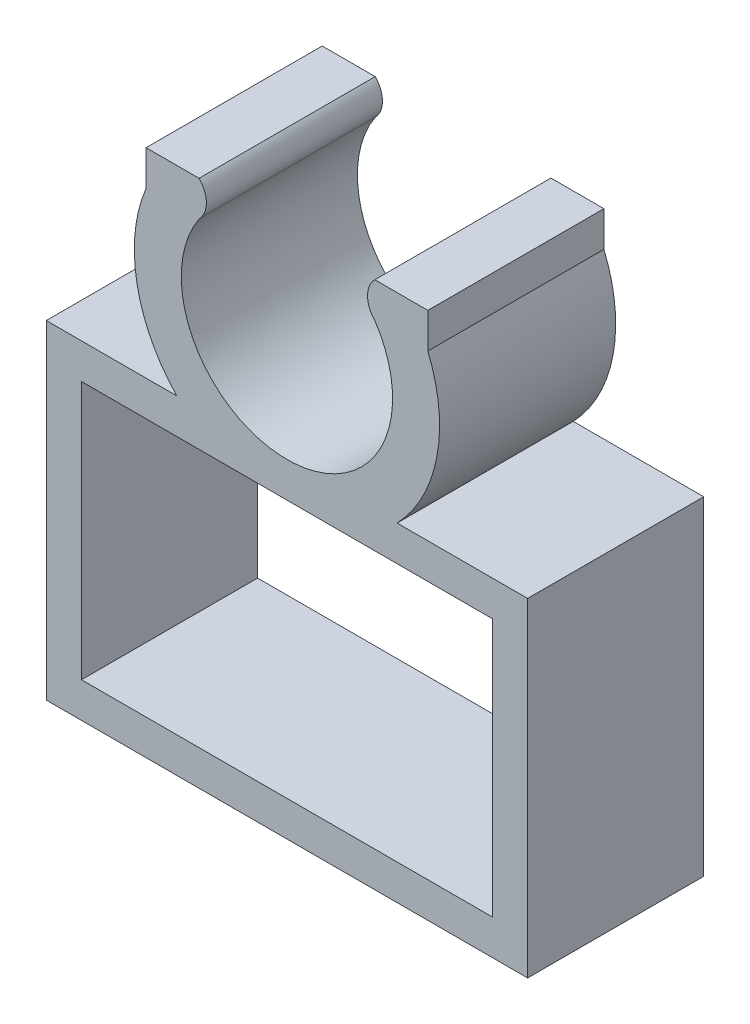
ISO-10303-21;
HEADER;
FILE_DESCRIPTION(('STEP AP214'),'2;1');
FILE_NAME('part.step','',(''),(''),'','','');
FILE_SCHEMA(('AUTOMOTIVE_DESIGN { 1 0 10303 214 1 1 1 1 }'));
ENDSEC;
DATA;
#1=APPLICATION_CONTEXT('core data for automotive mechanical design processes');
#2=APPLICATION_PROTOCOL_DEFINITION('international standard','automotive_design',2000,#1);
#3=PRODUCT_CONTEXT('',#1,'mechanical');
#4=PRODUCT('Part','Part','',(#3));
#5=PRODUCT_RELATED_PRODUCT_CATEGORY('part','',(#4));
#6=PRODUCT_DEFINITION_FORMATION('','',#4);
#7=PRODUCT_DEFINITION_CONTEXT('part definition',#1,'design');
#8=PRODUCT_DEFINITION('design','',#6,#7);
#9=PRODUCT_DEFINITION_SHAPE('','',#8);
#10=(LENGTH_UNIT() NAMED_UNIT(*) SI_UNIT(.MILLI.,.METRE.));
#11=(NAMED_UNIT(*) PLANE_ANGLE_UNIT() SI_UNIT($,.RADIAN.));
#12=(NAMED_UNIT(*) SI_UNIT($,.STERADIAN.) SOLID_ANGLE_UNIT());
#13=UNCERTAINTY_MEASURE_WITH_UNIT(LENGTH_MEASURE(1.E-05),#10,'distance_accuracy_value','');
#14=(GEOMETRIC_REPRESENTATION_CONTEXT(3) GLOBAL_UNCERTAINTY_ASSIGNED_CONTEXT((#13)) GLOBAL_UNIT_ASSIGNED_CONTEXT((#10,
#11,#12)) REPRESENTATION_CONTEXT('',''));
#15=CARTESIAN_POINT('',(0.,0.,0.));
#16=DIRECTION('',(0.,0.,1.));
#17=DIRECTION('',(1.,0.,0.));
#18=AXIS2_PLACEMENT_3D('',#15,#16,#17);
#19=CARTESIAN_POINT('',(-48.9571035799106,17.2183139224821,15.));
#20=DIRECTION('',(0.,0.,1.));
#21=DIRECTION('',(1.,0.,0.));
#22=AXIS2_PLACEMENT_3D('',#19,#20,#21);
#23=PLANE('',#22);
#24=DIRECTION('',(-1.,0.,0.));
#25=VECTOR('',#24,1.);
#26=CARTESIAN_POINT('',(-69.4571035799108,8.2183139224821,15.));
#27=LINE('',#26,#25);
#28=CARTESIAN_POINT('',(-58.3379350995576,8.2183139224821,15.));
#29=VERTEX_POINT('',#28);
#30=CARTESIAN_POINT('',(-69.4571035799108,8.2183139224821,15.));
#31=VERTEX_POINT('',#30);
#32=EDGE_CURVE('E194',#29,#31,#27,.T.);
#33=ORIENTED_EDGE('',*,*,#32,.T.);
#34=DIRECTION('',(0.,-1.,0.));
#35=VECTOR('',#34,1.);
#36=CARTESIAN_POINT('',(-69.4571035799108,8.2183139224821,15.));
#37=LINE('',#36,#35);
#38=CARTESIAN_POINT('',(-69.4571035799108,-19.7816860775179,15.));
#39=VERTEX_POINT('',#38);
#40=EDGE_CURVE('E197',#31,#39,#37,.T.);
#41=ORIENTED_EDGE('',*,*,#40,.T.);
#42=DIRECTION('',(1.,0.,0.));
#43=VECTOR('',#42,1.);
#44=CARTESIAN_POINT('',(-69.4571035799108,-19.7816860775179,15.));
#45=LINE('',#44,#43);
#46=CARTESIAN_POINT('',(-28.4571035799108,-19.7816860775179,15.));
#47=VERTEX_POINT('',#46);
#48=EDGE_CURVE('E200',#39,#47,#45,.T.);
#49=ORIENTED_EDGE('',*,*,#48,.T.);
#50=DIRECTION('',(0.,1.,0.));
#51=VECTOR('',#50,1.);
#52=CARTESIAN_POINT('',(-28.4571035799108,8.21831392248211,15.));
#53=LINE('',#52,#51);
#54=CARTESIAN_POINT('',(-28.4571035799108,8.21831392248211,15.));
#55=VERTEX_POINT('',#54);
#56=EDGE_CURVE('E202',#47,#55,#53,.T.);
#57=ORIENTED_EDGE('',*,*,#56,.T.);
#58=DIRECTION('',(-1.,0.,0.));
#59=VECTOR('',#58,1.);
#60=CARTESIAN_POINT('',(-28.4571035799108,8.21831392248211,15.));
#61=LINE('',#60,#59);
#62=CARTESIAN_POINT('',(-39.5762720602639,8.21831392248211,15.));
#63=VERTEX_POINT('',#62);
#64=EDGE_CURVE('E204',#55,#63,#61,.T.);
#65=ORIENTED_EDGE('',*,*,#64,.T.);
#66=CARTESIAN_POINT('',(-48.9571035799108,17.2183139224821,15.));
#67=DIRECTION('',(0.,0.,1.));
#68=DIRECTION('',(-1.,0.,0.));
#69=AXIS2_PLACEMENT_3D('',#66,#67,#68);
#70=CIRCLE('',#69,13.);
#71=CARTESIAN_POINT('',(-36.9571035799108,22.2183139224821,15.));
#72=VERTEX_POINT('',#71);
#73=EDGE_CURVE('E206',#63,#72,#70,.T.);
#74=ORIENTED_EDGE('',*,*,#73,.T.);
#75=DIRECTION('',(0.,1.,0.));
#76=VECTOR('',#75,1.);
#77=CARTESIAN_POINT('',(-36.9571035799108,25.2183139224821,15.));
#78=LINE('',#77,#76);
#79=CARTESIAN_POINT('',(-36.9571035799108,25.2183139224821,15.));
#80=VERTEX_POINT('',#79);
#81=EDGE_CURVE('E208',#72,#80,#78,.T.);
#82=ORIENTED_EDGE('',*,*,#81,.T.);
#83=DIRECTION('',(-1.,0.,0.));
#84=VECTOR('',#83,1.);
#85=CARTESIAN_POINT('',(-41.4737888063629,25.2183139224821,15.));
#86=LINE('',#85,#84);
#87=CARTESIAN_POINT('',(-41.4737888063629,25.2183139224821,15.));
#88=VERTEX_POINT('',#87);
#89=EDGE_CURVE('E210',#80,#88,#86,.T.);
#90=ORIENTED_EDGE('',*,*,#89,.T.);
#91=CARTESIAN_POINT('',(-39.9737888063629,23.7183139224821,15.));
#92=DIRECTION('',(0.,0.,1.));
#93=DIRECTION('',(-1.,0.,0.));
#94=AXIS2_PLACEMENT_3D('',#91,#92,#93);
#95=CIRCLE('',#94,2.12132034355964);
#96=CARTESIAN_POINT('',(-41.4737888063629,22.2183139224821,15.));
#97=VERTEX_POINT('',#96);
#98=EDGE_CURVE('E212',#88,#97,#95,.T.);
#99=ORIENTED_EDGE('',*,*,#98,.T.);
#100=CARTESIAN_POINT('',(-48.9571035799108,17.2183139224821,15.));
#101=DIRECTION('',(0.,0.,-1.));
#102=DIRECTION('',(1.,0.,0.));
#103=AXIS2_PLACEMENT_3D('',#100,#101,#102);
#104=CIRCLE('',#103,9.00000000000001);
#105=CARTESIAN_POINT('',(-56.4404183534587,22.2183139224821,15.));
#106=VERTEX_POINT('',#105);
#107=EDGE_CURVE('E214',#97,#106,#104,.T.);
#108=ORIENTED_EDGE('',*,*,#107,.T.);
#109=CARTESIAN_POINT('',(-57.9404183534587,23.7183139224821,15.));
#110=DIRECTION('',(0.,0.,1.));
#111=DIRECTION('',(1.,0.,0.));
#112=AXIS2_PLACEMENT_3D('',#109,#110,#111);
#113=CIRCLE('',#112,2.12132034355964);
#114=CARTESIAN_POINT('',(-56.4404183534587,25.2183139224821,15.));
#115=VERTEX_POINT('',#114);
#116=EDGE_CURVE('E216',#106,#115,#113,.T.);
#117=ORIENTED_EDGE('',*,*,#116,.T.);
#118=DIRECTION('',(-1.,0.,0.));
#119=VECTOR('',#118,1.);
#120=CARTESIAN_POINT('',(-56.4404183534587,25.2183139224821,15.));
#121=LINE('',#120,#119);
#122=CARTESIAN_POINT('',(-60.9571035799108,25.2183139224821,15.));
#123=VERTEX_POINT('',#122);
#124=EDGE_CURVE('E218',#115,#123,#121,.T.);
#125=ORIENTED_EDGE('',*,*,#124,.T.);
#126=DIRECTION('',(0.,-1.,0.));
#127=VECTOR('',#126,1.);
#128=CARTESIAN_POINT('',(-60.9571035799108,25.2183139224821,15.));
#129=LINE('',#128,#127);
#130=CARTESIAN_POINT('',(-60.9571035799108,22.2183139224821,15.));
#131=VERTEX_POINT('',#130);
#132=EDGE_CURVE('E220',#123,#131,#129,.T.);
#133=ORIENTED_EDGE('',*,*,#132,.T.);
#134=CARTESIAN_POINT('',(-48.9571035799106,17.2183139224821,15.));
#135=DIRECTION('',(0.,0.,1.));
#136=DIRECTION('',(1.,0.,0.));
#137=AXIS2_PLACEMENT_3D('',#134,#135,#136);
#138=CIRCLE('',#137,13.0000000000001);
#139=EDGE_CURVE('E222',#131,#29,#138,.T.);
#140=ORIENTED_EDGE('',*,*,#139,.T.);
#141=EDGE_LOOP('',(#33,#41,#49,#57,#65,#74,#82,#90,#99,#108,#117,#125,#133,#140));
#142=FACE_BOUND('',#141,.T.);
#143=DIRECTION('',(1.,0.,0.));
#144=VECTOR('',#143,1.);
#145=CARTESIAN_POINT('',(-66.4571035799108,-16.7816860775179,15.));
#146=LINE('',#145,#144);
#147=CARTESIAN_POINT('',(-66.4571035799108,-16.7816860775179,15.));
#148=VERTEX_POINT('',#147);
#149=CARTESIAN_POINT('',(-31.4571035799108,-16.7816860775179,15.));
#150=VERTEX_POINT('',#149);
#151=EDGE_CURVE('E166',#148,#150,#146,.T.);
#152=ORIENTED_EDGE('',*,*,#151,.F.);
#153=DIRECTION('',(0.,-1.,0.));
#154=VECTOR('',#153,1.);
#155=CARTESIAN_POINT('',(-66.4571035799108,5.21831392248211,15.));
#156=LINE('',#155,#154);
#157=CARTESIAN_POINT('',(-66.4571035799108,5.21831392248211,15.));
#158=VERTEX_POINT('',#157);
#159=EDGE_CURVE('E158',#158,#148,#156,.T.);
#160=ORIENTED_EDGE('',*,*,#159,.F.);
#161=DIRECTION('',(-1.,0.,0.));
#162=VECTOR('',#161,1.);
#163=CARTESIAN_POINT('',(-66.4571035799108,5.21831392248211,15.));
#164=LINE('',#163,#162);
#165=CARTESIAN_POINT('',(-31.4571035799108,5.21831392248211,15.));
#166=VERTEX_POINT('',#165);
#167=EDGE_CURVE('E180',#166,#158,#164,.T.);
#168=ORIENTED_EDGE('',*,*,#167,.F.);
#169=DIRECTION('',(0.,1.,0.));
#170=VECTOR('',#169,1.);
#171=CARTESIAN_POINT('',(-31.4571035799108,5.21831392248211,15.));
#172=LINE('',#171,#170);
#173=EDGE_CURVE('E178',#150,#166,#172,.T.);
#174=ORIENTED_EDGE('',*,*,#173,.F.);
#175=EDGE_LOOP('',(#152,#160,#168,#174));
#176=FACE_BOUND('',#175,.T.);
#177=ADVANCED_FACE('F33',(#142,#176),#23,.T.);
#178=CARTESIAN_POINT('',(-48.9571035799106,17.2183139224821,0.));
#179=DIRECTION('',(0.,0.,1.));
#180=DIRECTION('',(1.,0.,0.));
#181=AXIS2_PLACEMENT_3D('',#178,#179,#180);
#182=PLANE('',#181);
#183=DIRECTION('',(-1.,0.,0.));
#184=VECTOR('',#183,1.);
#185=CARTESIAN_POINT('',(-69.4571035799108,8.2183139224821,0.));
#186=LINE('',#185,#184);
#187=CARTESIAN_POINT('',(-58.3379350995576,8.2183139224821,0.));
#188=VERTEX_POINT('',#187);
#189=CARTESIAN_POINT('',(-69.4571035799108,8.2183139224821,0.));
#190=VERTEX_POINT('',#189);
#191=EDGE_CURVE('E174',#188,#190,#186,.T.);
#192=ORIENTED_EDGE('',*,*,#191,.F.);
#193=CARTESIAN_POINT('',(-48.9571035799106,17.2183139224821,0.));
#194=DIRECTION('',(0.,0.,1.));
#195=DIRECTION('',(1.,0.,0.));
#196=AXIS2_PLACEMENT_3D('',#193,#194,#195);
#197=CIRCLE('',#196,13.0000000000001);
#198=CARTESIAN_POINT('',(-60.9571035799108,22.2183139224821,0.));
#199=VERTEX_POINT('',#198);
#200=EDGE_CURVE('E198',#199,#188,#197,.T.);
#201=ORIENTED_EDGE('',*,*,#200,.F.);
#202=DIRECTION('',(0.,-1.,0.));
#203=VECTOR('',#202,1.);
#204=CARTESIAN_POINT('',(-60.9571035799108,25.2183139224821,0.));
#205=LINE('',#204,#203);
#206=CARTESIAN_POINT('',(-60.9571035799108,25.2183139224821,0.));
#207=VERTEX_POINT('',#206);
#208=EDGE_CURVE('E249',#207,#199,#205,.T.);
#209=ORIENTED_EDGE('',*,*,#208,.F.);
#210=DIRECTION('',(-1.,0.,0.));
#211=VECTOR('',#210,1.);
#212=CARTESIAN_POINT('',(-56.4404183534587,25.2183139224821,0.));
#213=LINE('',#212,#211);
#214=CARTESIAN_POINT('',(-56.4404183534587,25.2183139224821,0.));
#215=VERTEX_POINT('',#214);
#216=EDGE_CURVE('E247',#215,#207,#213,.T.);
#217=ORIENTED_EDGE('',*,*,#216,.F.);
#218=CARTESIAN_POINT('',(-57.9404183534587,23.7183139224821,0.));
#219=DIRECTION('',(0.,0.,1.));
#220=DIRECTION('',(1.,0.,0.));
#221=AXIS2_PLACEMENT_3D('',#218,#219,#220);
#222=CIRCLE('',#221,2.12132034355964);
#223=CARTESIAN_POINT('',(-56.4404183534587,22.2183139224821,0.));
#224=VERTEX_POINT('',#223);
#225=EDGE_CURVE('E245',#224,#215,#222,.T.);
#226=ORIENTED_EDGE('',*,*,#225,.F.);
#227=CARTESIAN_POINT('',(-48.9571035799108,17.2183139224821,0.));
#228=DIRECTION('',(0.,0.,-1.));
#229=DIRECTION('',(1.,0.,0.));
#230=AXIS2_PLACEMENT_3D('',#227,#228,#229);
#231=CIRCLE('',#230,9.00000000000001);
#232=CARTESIAN_POINT('',(-41.4737888063629,22.2183139224821,0.));
#233=VERTEX_POINT('',#232);
#234=EDGE_CURVE('E243',#233,#224,#231,.T.);
#235=ORIENTED_EDGE('',*,*,#234,.F.);
#236=CARTESIAN_POINT('',(-39.9737888063629,23.7183139224821,0.));
#237=DIRECTION('',(0.,0.,1.));
#238=DIRECTION('',(-1.,0.,0.));
#239=AXIS2_PLACEMENT_3D('',#236,#237,#238);
#240=CIRCLE('',#239,2.12132034355964);
#241=CARTESIAN_POINT('',(-41.4737888063629,25.2183139224821,0.));
#242=VERTEX_POINT('',#241);
#243=EDGE_CURVE('E241',#242,#233,#240,.T.);
#244=ORIENTED_EDGE('',*,*,#243,.F.);
#245=DIRECTION('',(-1.,0.,0.));
#246=VECTOR('',#245,1.);
#247=CARTESIAN_POINT('',(-41.4737888063629,25.2183139224821,0.));
#248=LINE('',#247,#246);
#249=CARTESIAN_POINT('',(-36.9571035799108,25.2183139224821,0.));
#250=VERTEX_POINT('',#249);
#251=EDGE_CURVE('E239',#250,#242,#248,.T.);
#252=ORIENTED_EDGE('',*,*,#251,.F.);
#253=DIRECTION('',(0.,1.,0.));
#254=VECTOR('',#253,1.);
#255=CARTESIAN_POINT('',(-36.9571035799108,25.2183139224821,0.));
#256=LINE('',#255,#254);
#257=CARTESIAN_POINT('',(-36.9571035799108,22.2183139224821,0.));
#258=VERTEX_POINT('',#257);
#259=EDGE_CURVE('E237',#258,#250,#256,.T.);
#260=ORIENTED_EDGE('',*,*,#259,.F.);
#261=CARTESIAN_POINT('',(-48.9571035799108,17.2183139224821,0.));
#262=DIRECTION('',(0.,0.,1.));
#263=DIRECTION('',(-1.,0.,0.));
#264=AXIS2_PLACEMENT_3D('',#261,#262,#263);
#265=CIRCLE('',#264,13.);
#266=CARTESIAN_POINT('',(-39.5762720602639,8.21831392248211,0.));
#267=VERTEX_POINT('',#266);
#268=EDGE_CURVE('E235',#267,#258,#265,.T.);
#269=ORIENTED_EDGE('',*,*,#268,.F.);
#270=DIRECTION('',(-1.,0.,0.));
#271=VECTOR('',#270,1.);
#272=CARTESIAN_POINT('',(-28.4571035799108,8.21831392248211,0.));
#273=LINE('',#272,#271);
#274=CARTESIAN_POINT('',(-28.4571035799108,8.21831392248211,0.));
#275=VERTEX_POINT('',#274);
#276=EDGE_CURVE('E233',#275,#267,#273,.T.);
#277=ORIENTED_EDGE('',*,*,#276,.F.);
#278=DIRECTION('',(0.,1.,0.));
#279=VECTOR('',#278,1.);
#280=CARTESIAN_POINT('',(-28.4571035799108,8.21831392248211,0.));
#281=LINE('',#280,#279);
#282=CARTESIAN_POINT('',(-28.4571035799108,-19.7816860775179,0.));
#283=VERTEX_POINT('',#282);
#284=EDGE_CURVE('E231',#283,#275,#281,.T.);
#285=ORIENTED_EDGE('',*,*,#284,.F.);
#286=DIRECTION('',(1.,0.,0.));
#287=VECTOR('',#286,1.);
#288=CARTESIAN_POINT('',(-69.4571035799108,-19.7816860775179,0.));
#289=LINE('',#288,#287);
#290=CARTESIAN_POINT('',(-69.4571035799108,-19.7816860775179,0.));
#291=VERTEX_POINT('',#290);
#292=EDGE_CURVE('E229',#291,#283,#289,.T.);
#293=ORIENTED_EDGE('',*,*,#292,.F.);
#294=DIRECTION('',(0.,-1.,0.));
#295=VECTOR('',#294,1.);
#296=CARTESIAN_POINT('',(-69.4571035799108,8.2183139224821,0.));
#297=LINE('',#296,#295);
#298=EDGE_CURVE('E227',#190,#291,#297,.T.);
#299=ORIENTED_EDGE('',*,*,#298,.F.);
#300=EDGE_LOOP('',(#192,#201,#209,#217,#226,#235,#244,#252,#260,#269,#277,#285,#293,#299));
#301=FACE_BOUND('',#300,.T.);
#302=DIRECTION('',(0.,-1.,0.));
#303=VECTOR('',#302,1.);
#304=CARTESIAN_POINT('',(-66.4571035799108,5.21831392248211,0.));
#305=LINE('',#304,#303);
#306=CARTESIAN_POINT('',(-66.4571035799108,5.21831392248211,0.));
#307=VERTEX_POINT('',#306);
#308=CARTESIAN_POINT('',(-66.4571035799108,-16.7816860775179,0.));
#309=VERTEX_POINT('',#308);
#310=EDGE_CURVE('E56',#307,#309,#305,.T.);
#311=ORIENTED_EDGE('',*,*,#310,.T.);
#312=DIRECTION('',(1.,0.,0.));
#313=VECTOR('',#312,1.);
#314=CARTESIAN_POINT('',(-66.4571035799108,-16.7816860775179,0.));
#315=LINE('',#314,#313);
#316=CARTESIAN_POINT('',(-31.4571035799108,-16.7816860775179,0.));
#317=VERTEX_POINT('',#316);
#318=EDGE_CURVE('E173',#309,#317,#315,.T.);
#319=ORIENTED_EDGE('',*,*,#318,.T.);
#320=DIRECTION('',(0.,1.,0.));
#321=VECTOR('',#320,1.);
#322=CARTESIAN_POINT('',(-31.4571035799108,5.21831392248211,0.));
#323=LINE('',#322,#321);
#324=CARTESIAN_POINT('',(-31.4571035799108,5.21831392248211,0.));
#325=VERTEX_POINT('',#324);
#326=EDGE_CURVE('E186',#317,#325,#323,.T.);
#327=ORIENTED_EDGE('',*,*,#326,.T.);
#328=DIRECTION('',(-1.,0.,0.));
#329=VECTOR('',#328,1.);
#330=CARTESIAN_POINT('',(-66.4571035799108,5.21831392248211,0.));
#331=LINE('',#330,#329);
#332=EDGE_CURVE('E167',#325,#307,#331,.T.);
#333=ORIENTED_EDGE('',*,*,#332,.T.);
#334=EDGE_LOOP('',(#311,#319,#327,#333));
#335=FACE_BOUND('',#334,.T.);
#336=ADVANCED_FACE('F297',(#301,#335),#182,.F.);
#337=CARTESIAN_POINT('',(-69.4571035799108,8.2183139224821,15.));
#338=DIRECTION('',(0.,-1.,0.));
#339=DIRECTION('',(1.,0.,0.));
#340=AXIS2_PLACEMENT_3D('',#337,#338,#339);
#341=PLANE('',#340);
#342=ORIENTED_EDGE('',*,*,#191,.T.);
#343=DIRECTION('',(0.,0.,-1.));
#344=VECTOR('',#343,1.);
#345=CARTESIAN_POINT('',(-69.4571035799108,8.2183139224821,15.));
#346=LINE('',#345,#344);
#347=EDGE_CURVE('E11',#31,#190,#346,.T.);
#348=ORIENTED_EDGE('',*,*,#347,.F.);
#349=ORIENTED_EDGE('',*,*,#32,.F.);
#350=DIRECTION('',(0.,0.,-1.));
#351=VECTOR('',#350,1.);
#352=CARTESIAN_POINT('',(-58.3379350995576,8.2183139224821,15.));
#353=LINE('',#352,#351);
#354=EDGE_CURVE('E224',#29,#188,#353,.T.);
#355=ORIENTED_EDGE('',*,*,#354,.T.);
#356=EDGE_LOOP('',(#342,#348,#349,#355));
#357=FACE_BOUND('',#356,.T.);
#358=ADVANCED_FACE('F35',(#357),#341,.F.);
#359=CARTESIAN_POINT('',(-69.4571035799108,8.2183139224821,15.));
#360=DIRECTION('',(1.,0.,0.));
#361=DIRECTION('',(0.,0.,-1.));
#362=AXIS2_PLACEMENT_3D('',#359,#360,#361);
#363=PLANE('',#362);
#364=ORIENTED_EDGE('',*,*,#298,.T.);
#365=DIRECTION('',(0.,0.,-1.));
#366=VECTOR('',#365,1.);
#367=CARTESIAN_POINT('',(-69.4571035799108,-19.7816860775179,15.));
#368=LINE('',#367,#366);
#369=EDGE_CURVE('E41',#39,#291,#368,.T.);
#370=ORIENTED_EDGE('',*,*,#369,.F.);
#371=ORIENTED_EDGE('',*,*,#40,.F.);
#372=ORIENTED_EDGE('',*,*,#347,.T.);
#373=EDGE_LOOP('',(#364,#370,#371,#372));
#374=FACE_BOUND('',#373,.T.);
#375=ADVANCED_FACE('F314',(#374),#363,.F.);
#376=CARTESIAN_POINT('',(-69.4571035799108,-19.7816860775179,15.));
#377=DIRECTION('',(0.,1.,0.));
#378=DIRECTION('',(0.,0.,1.));
#379=AXIS2_PLACEMENT_3D('',#376,#377,#378);
#380=PLANE('',#379);
#381=ORIENTED_EDGE('',*,*,#292,.T.);
#382=DIRECTION('',(0.,0.,-1.));
#383=VECTOR('',#382,1.);
#384=CARTESIAN_POINT('',(-28.4571035799108,-19.7816860775179,15.));
#385=LINE('',#384,#383);
#386=EDGE_CURVE('E284',#47,#283,#385,.T.);
#387=ORIENTED_EDGE('',*,*,#386,.F.);
#388=ORIENTED_EDGE('',*,*,#48,.F.);
#389=ORIENTED_EDGE('',*,*,#369,.T.);
#390=EDGE_LOOP('',(#381,#387,#388,#389));
#391=FACE_BOUND('',#390,.T.);
#392=ADVANCED_FACE('F291',(#391),#380,.F.);
#393=CARTESIAN_POINT('',(-28.4571035799108,8.21831392248211,15.));
#394=DIRECTION('',(-1.,0.,0.));
#395=DIRECTION('',(0.,-1.,0.));
#396=AXIS2_PLACEMENT_3D('',#393,#394,#395);
#397=PLANE('',#396);
#398=ORIENTED_EDGE('',*,*,#284,.T.);
#399=DIRECTION('',(0.,0.,-1.));
#400=VECTOR('',#399,1.);
#401=CARTESIAN_POINT('',(-28.4571035799108,8.21831392248211,15.));
#402=LINE('',#401,#400);
#403=EDGE_CURVE('E281',#55,#275,#402,.T.);
#404=ORIENTED_EDGE('',*,*,#403,.F.);
#405=ORIENTED_EDGE('',*,*,#56,.F.);
#406=ORIENTED_EDGE('',*,*,#386,.T.);
#407=EDGE_LOOP('',(#398,#404,#405,#406));
#408=FACE_BOUND('',#407,.T.);
#409=ADVANCED_FACE('F303',(#408),#397,.F.);
#410=CARTESIAN_POINT('',(-28.4571035799108,8.21831392248211,15.));
#411=DIRECTION('',(0.,-1.,0.));
#412=DIRECTION('',(1.,0.,0.));
#413=AXIS2_PLACEMENT_3D('',#410,#411,#412);
#414=PLANE('',#413);
#415=ORIENTED_EDGE('',*,*,#276,.T.);
#416=DIRECTION('',(0.,0.,-1.));
#417=VECTOR('',#416,1.);
#418=CARTESIAN_POINT('',(-39.5762720602639,8.21831392248211,15.));
#419=LINE('',#418,#417);
#420=EDGE_CURVE('E278',#63,#267,#419,.T.);
#421=ORIENTED_EDGE('',*,*,#420,.F.);
#422=ORIENTED_EDGE('',*,*,#64,.F.);
#423=ORIENTED_EDGE('',*,*,#403,.T.);
#424=EDGE_LOOP('',(#415,#421,#422,#423));
#425=FACE_BOUND('',#424,.T.);
#426=ADVANCED_FACE('F307',(#425),#414,.F.);
#427=CARTESIAN_POINT('',(-48.9571035799108,17.2183139224821,15.));
#428=DIRECTION('',(0.,0.,-1.));
#429=DIRECTION('',(-1.,0.,0.));
#430=AXIS2_PLACEMENT_3D('',#427,#428,#429);
#431=CYLINDRICAL_SURFACE('',#430,13.);
#432=ORIENTED_EDGE('',*,*,#268,.T.);
#433=DIRECTION('',(0.,0.,-1.));
#434=VECTOR('',#433,1.);
#435=CARTESIAN_POINT('',(-36.9571035799108,22.2183139224821,15.));
#436=LINE('',#435,#434);
#437=EDGE_CURVE('E275',#72,#258,#436,.T.);
#438=ORIENTED_EDGE('',*,*,#437,.F.);
#439=ORIENTED_EDGE('',*,*,#73,.F.);
#440=ORIENTED_EDGE('',*,*,#420,.T.);
#441=EDGE_LOOP('',(#432,#438,#439,#440));
#442=FACE_BOUND('',#441,.T.);
#443=ADVANCED_FACE('F357',(#442),#431,.T.);
#444=CARTESIAN_POINT('',(-36.9571035799108,25.2183139224821,15.));
#445=DIRECTION('',(-1.,0.,0.));
#446=DIRECTION('',(0.,0.,1.));
#447=AXIS2_PLACEMENT_3D('',#444,#445,#446);
#448=PLANE('',#447);
#449=ORIENTED_EDGE('',*,*,#259,.T.);
#450=DIRECTION('',(0.,0.,-1.));
#451=VECTOR('',#450,1.);
#452=CARTESIAN_POINT('',(-36.9571035799108,25.2183139224821,15.));
#453=LINE('',#452,#451);
#454=EDGE_CURVE('E272',#80,#250,#453,.T.);
#455=ORIENTED_EDGE('',*,*,#454,.F.);
#456=ORIENTED_EDGE('',*,*,#81,.F.);
#457=ORIENTED_EDGE('',*,*,#437,.T.);
#458=EDGE_LOOP('',(#449,#455,#456,#457));
#459=FACE_BOUND('',#458,.T.);
#460=ADVANCED_FACE('F355',(#459),#448,.F.);
#461=CARTESIAN_POINT('',(-41.4737888063629,25.2183139224821,15.));
#462=DIRECTION('',(0.,-1.,0.));
#463=DIRECTION('',(0.,0.,-1.));
#464=AXIS2_PLACEMENT_3D('',#461,#462,#463);
#465=PLANE('',#464);
#466=ORIENTED_EDGE('',*,*,#251,.T.);
#467=DIRECTION('',(0.,0.,-1.));
#468=VECTOR('',#467,1.);
#469=CARTESIAN_POINT('',(-41.4737888063629,25.2183139224821,15.));
#470=LINE('',#469,#468);
#471=EDGE_CURVE('E269',#88,#242,#470,.T.);
#472=ORIENTED_EDGE('',*,*,#471,.F.);
#473=ORIENTED_EDGE('',*,*,#89,.F.);
#474=ORIENTED_EDGE('',*,*,#454,.T.);
#475=EDGE_LOOP('',(#466,#472,#473,#474));
#476=FACE_BOUND('',#475,.T.);
#477=ADVANCED_FACE('F350',(#476),#465,.F.);
#478=CARTESIAN_POINT('',(-39.9737888063629,23.7183139224821,15.));
#479=DIRECTION('',(0.,0.,-1.));
#480=DIRECTION('',(-1.,0.,0.));
#481=AXIS2_PLACEMENT_3D('',#478,#479,#480);
#482=CYLINDRICAL_SURFACE('',#481,2.12132034355964);
#483=ORIENTED_EDGE('',*,*,#243,.T.);
#484=DIRECTION('',(0.,0.,-1.));
#485=VECTOR('',#484,1.);
#486=CARTESIAN_POINT('',(-41.4737888063629,22.2183139224821,15.));
#487=LINE('',#486,#485);
#488=EDGE_CURVE('E266',#97,#233,#487,.T.);
#489=ORIENTED_EDGE('',*,*,#488,.F.);
#490=ORIENTED_EDGE('',*,*,#98,.F.);
#491=ORIENTED_EDGE('',*,*,#471,.T.);
#492=EDGE_LOOP('',(#483,#489,#490,#491));
#493=FACE_BOUND('',#492,.T.);
#494=ADVANCED_FACE('F345',(#493),#482,.T.);
#495=CARTESIAN_POINT('',(-48.9571035799108,17.2183139224821,15.));
#496=DIRECTION('',(0.,0.,-1.));
#497=DIRECTION('',(-1.,0.,0.));
#498=AXIS2_PLACEMENT_3D('',#495,#496,#497);
#499=CYLINDRICAL_SURFACE('',#498,9.00000000000001);
#500=ORIENTED_EDGE('',*,*,#234,.T.);
#501=DIRECTION('',(0.,0.,-1.));
#502=VECTOR('',#501,1.);
#503=CARTESIAN_POINT('',(-56.4404183534587,22.2183139224821,15.));
#504=LINE('',#503,#502);
#505=EDGE_CURVE('E263',#106,#224,#504,.T.);
#506=ORIENTED_EDGE('',*,*,#505,.F.);
#507=ORIENTED_EDGE('',*,*,#107,.F.);
#508=ORIENTED_EDGE('',*,*,#488,.T.);
#509=EDGE_LOOP('',(#500,#506,#507,#508));
#510=FACE_BOUND('',#509,.T.);
#511=ADVANCED_FACE('F341',(#510),#499,.F.);
#512=CARTESIAN_POINT('',(-57.9404183534587,23.7183139224821,15.));
#513=DIRECTION('',(0.,0.,-1.));
#514=DIRECTION('',(-1.,0.,0.));
#515=AXIS2_PLACEMENT_3D('',#512,#513,#514);
#516=CYLINDRICAL_SURFACE('',#515,2.12132034355964);
#517=ORIENTED_EDGE('',*,*,#225,.T.);
#518=DIRECTION('',(0.,0.,-1.));
#519=VECTOR('',#518,1.);
#520=CARTESIAN_POINT('',(-56.4404183534587,25.2183139224821,15.));
#521=LINE('',#520,#519);
#522=EDGE_CURVE('E260',#115,#215,#521,.T.);
#523=ORIENTED_EDGE('',*,*,#522,.F.);
#524=ORIENTED_EDGE('',*,*,#116,.F.);
#525=ORIENTED_EDGE('',*,*,#505,.T.);
#526=EDGE_LOOP('',(#517,#523,#524,#525));
#527=FACE_BOUND('',#526,.T.);
#528=ADVANCED_FACE('F336',(#527),#516,.T.);
#529=CARTESIAN_POINT('',(-56.4404183534587,25.2183139224821,15.));
#530=DIRECTION('',(0.,-1.,0.));
#531=DIRECTION('',(0.,0.,-1.));
#532=AXIS2_PLACEMENT_3D('',#529,#530,#531);
#533=PLANE('',#532);
#534=ORIENTED_EDGE('',*,*,#216,.T.);
#535=DIRECTION('',(0.,0.,-1.));
#536=VECTOR('',#535,1.);
#537=CARTESIAN_POINT('',(-60.9571035799108,25.2183139224821,15.));
#538=LINE('',#537,#536);
#539=EDGE_CURVE('E257',#123,#207,#538,.T.);
#540=ORIENTED_EDGE('',*,*,#539,.F.);
#541=ORIENTED_EDGE('',*,*,#124,.F.);
#542=ORIENTED_EDGE('',*,*,#522,.T.);
#543=EDGE_LOOP('',(#534,#540,#541,#542));
#544=FACE_BOUND('',#543,.T.);
#545=ADVANCED_FACE('F330',(#544),#533,.F.);
#546=CARTESIAN_POINT('',(-60.9571035799108,25.2183139224821,15.));
#547=DIRECTION('',(1.,0.,0.));
#548=DIRECTION('',(0.,0.,-1.));
#549=AXIS2_PLACEMENT_3D('',#546,#547,#548);
#550=PLANE('',#549);
#551=ORIENTED_EDGE('',*,*,#208,.T.);
#552=DIRECTION('',(0.,0.,-1.));
#553=VECTOR('',#552,1.);
#554=CARTESIAN_POINT('',(-60.9571035799108,22.2183139224821,15.));
#555=LINE('',#554,#553);
#556=EDGE_CURVE('E254',#131,#199,#555,.T.);
#557=ORIENTED_EDGE('',*,*,#556,.F.);
#558=ORIENTED_EDGE('',*,*,#132,.F.);
#559=ORIENTED_EDGE('',*,*,#539,.T.);
#560=EDGE_LOOP('',(#551,#557,#558,#559));
#561=FACE_BOUND('',#560,.T.);
#562=ADVANCED_FACE('F326',(#561),#550,.F.);
#563=CARTESIAN_POINT('',(-48.9571035799106,17.2183139224821,15.));
#564=DIRECTION('',(0.,0.,-1.));
#565=DIRECTION('',(-1.,0.,0.));
#566=AXIS2_PLACEMENT_3D('',#563,#564,#565);
#567=CYLINDRICAL_SURFACE('',#566,13.0000000000001);
#568=ORIENTED_EDGE('',*,*,#200,.T.);
#569=ORIENTED_EDGE('',*,*,#354,.F.);
#570=ORIENTED_EDGE('',*,*,#139,.F.);
#571=ORIENTED_EDGE('',*,*,#556,.T.);
#572=EDGE_LOOP('',(#568,#569,#570,#571));
#573=FACE_BOUND('',#572,.T.);
#574=ADVANCED_FACE('F321',(#573),#567,.T.);
#575=CARTESIAN_POINT('',(-66.4571035799108,5.21831392248211,15.));
#576=DIRECTION('',(1.,0.,0.));
#577=DIRECTION('',(0.,0.,-1.));
#578=AXIS2_PLACEMENT_3D('',#575,#576,#577);
#579=PLANE('',#578);
#580=ORIENTED_EDGE('',*,*,#310,.F.);
#581=DIRECTION('',(0.,0.,-1.));
#582=VECTOR('',#581,1.);
#583=CARTESIAN_POINT('',(-66.4571035799108,5.21831392248211,15.));
#584=LINE('',#583,#582);
#585=EDGE_CURVE('E162',#158,#307,#584,.T.);
#586=ORIENTED_EDGE('',*,*,#585,.F.);
#587=ORIENTED_EDGE('',*,*,#159,.T.);
#588=DIRECTION('',(0.,0.,-1.));
#589=VECTOR('',#588,1.);
#590=CARTESIAN_POINT('',(-66.4571035799108,-16.7816860775179,15.));
#591=LINE('',#590,#589);
#592=EDGE_CURVE('E161',#148,#309,#591,.T.);
#593=ORIENTED_EDGE('',*,*,#592,.T.);
#594=EDGE_LOOP('',(#580,#586,#587,#593));
#595=FACE_BOUND('',#594,.T.);
#596=ADVANCED_FACE('F160',(#595),#579,.T.);
#597=CARTESIAN_POINT('',(-66.4571035799108,-16.7816860775179,15.));
#598=DIRECTION('',(0.,1.,0.));
#599=DIRECTION('',(0.,0.,1.));
#600=AXIS2_PLACEMENT_3D('',#597,#598,#599);
#601=PLANE('',#600);
#602=ORIENTED_EDGE('',*,*,#318,.F.);
#603=ORIENTED_EDGE('',*,*,#592,.F.);
#604=ORIENTED_EDGE('',*,*,#151,.T.);
#605=DIRECTION('',(0.,0.,-1.));
#606=VECTOR('',#605,1.);
#607=CARTESIAN_POINT('',(-31.4571035799108,-16.7816860775179,15.));
#608=LINE('',#607,#606);
#609=EDGE_CURVE('E175',#150,#317,#608,.T.);
#610=ORIENTED_EDGE('',*,*,#609,.T.);
#611=EDGE_LOOP('',(#602,#603,#604,#610));
#612=FACE_BOUND('',#611,.T.);
#613=ADVANCED_FACE('F170',(#612),#601,.T.);
#614=CARTESIAN_POINT('',(-31.4571035799108,5.21831392248211,15.));
#615=DIRECTION('',(-1.,0.,0.));
#616=DIRECTION('',(0.,0.,1.));
#617=AXIS2_PLACEMENT_3D('',#614,#615,#616);
#618=PLANE('',#617);
#619=ORIENTED_EDGE('',*,*,#326,.F.);
#620=ORIENTED_EDGE('',*,*,#609,.F.);
#621=ORIENTED_EDGE('',*,*,#173,.T.);
#622=DIRECTION('',(0.,0.,-1.));
#623=VECTOR('',#622,1.);
#624=CARTESIAN_POINT('',(-31.4571035799108,5.21831392248211,15.));
#625=LINE('',#624,#623);
#626=EDGE_CURVE('E48',#166,#325,#625,.T.);
#627=ORIENTED_EDGE('',*,*,#626,.T.);
#628=EDGE_LOOP('',(#619,#620,#621,#627));
#629=FACE_BOUND('',#628,.T.);
#630=ADVANCED_FACE('F427',(#629),#618,.T.);
#631=CARTESIAN_POINT('',(-66.4571035799108,5.21831392248211,15.));
#632=DIRECTION('',(0.,-1.,0.));
#633=DIRECTION('',(1.,0.,0.));
#634=AXIS2_PLACEMENT_3D('',#631,#632,#633);
#635=PLANE('',#634);
#636=ORIENTED_EDGE('',*,*,#332,.F.);
#637=ORIENTED_EDGE('',*,*,#626,.F.);
#638=ORIENTED_EDGE('',*,*,#167,.T.);
#639=ORIENTED_EDGE('',*,*,#585,.T.);
#640=EDGE_LOOP('',(#636,#637,#638,#639));
#641=FACE_BOUND('',#640,.T.);
#642=ADVANCED_FACE('F433',(#641),#635,.T.);
#643=CLOSED_SHELL('',(#177,#336,#358,#375,#392,#409,#426,#443,#460,#477,#494,#511,#528,#545,
#562,#574,#596,#613,#630,#642));
#644=MANIFOLD_SOLID_BREP('B2',#643);
#645=ADVANCED_BREP_SHAPE_REPRESENTATION('',(#18,#644),#14);
#646=SHAPE_DEFINITION_REPRESENTATION(#9,#645);
ENDSEC;
END-ISO-10303-21;
